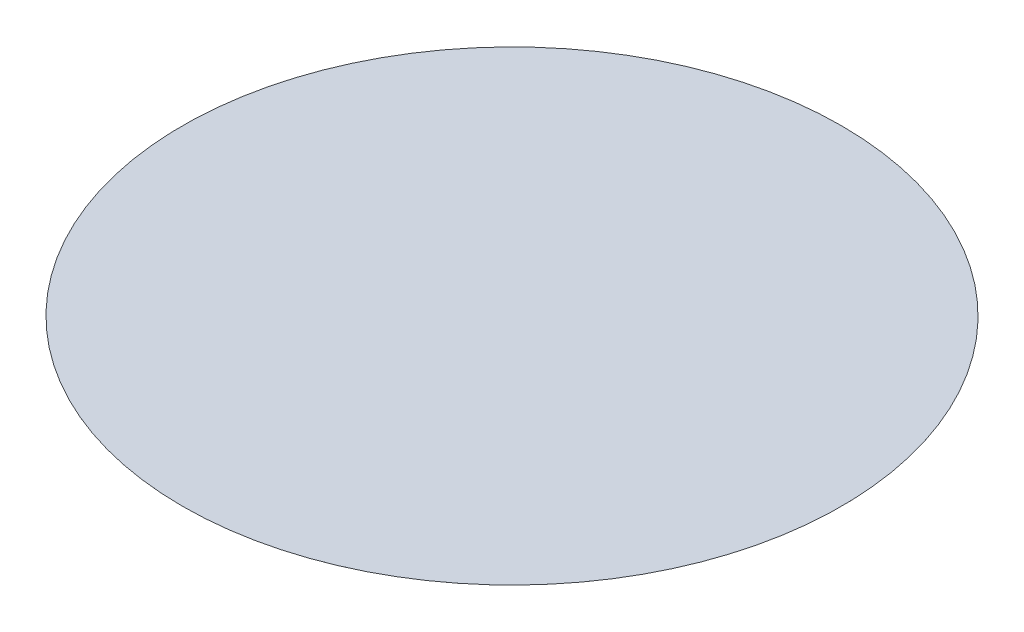
ISO-10303-21;
HEADER;
FILE_DESCRIPTION(('STEP AP214'),'2;1');
FILE_NAME('part.step','',(''),(''),'','','');
FILE_SCHEMA(('AUTOMOTIVE_DESIGN { 1 0 10303 214 1 1 1 1 }'));
ENDSEC;
DATA;
#1=APPLICATION_CONTEXT('core data for automotive mechanical design processes');
#2=APPLICATION_PROTOCOL_DEFINITION('international standard','automotive_design',2000,#1);
#3=PRODUCT_CONTEXT('',#1,'mechanical');
#4=PRODUCT('Part','Part','',(#3));
#5=PRODUCT_RELATED_PRODUCT_CATEGORY('part','',(#4));
#6=PRODUCT_DEFINITION_FORMATION('','',#4);
#7=PRODUCT_DEFINITION_CONTEXT('part definition',#1,'design');
#8=PRODUCT_DEFINITION('design','',#6,#7);
#9=PRODUCT_DEFINITION_SHAPE('','',#8);
#10=(LENGTH_UNIT() NAMED_UNIT(*) SI_UNIT(.MILLI.,.METRE.));
#11=(NAMED_UNIT(*) PLANE_ANGLE_UNIT() SI_UNIT($,.RADIAN.));
#12=(NAMED_UNIT(*) SI_UNIT($,.STERADIAN.) SOLID_ANGLE_UNIT());
#13=UNCERTAINTY_MEASURE_WITH_UNIT(LENGTH_MEASURE(1.E-05),#10,'distance_accuracy_value','');
#14=(GEOMETRIC_REPRESENTATION_CONTEXT(3) GLOBAL_UNCERTAINTY_ASSIGNED_CONTEXT((#13)) GLOBAL_UNIT_ASSIGNED_CONTEXT((#10,
#11,#12)) REPRESENTATION_CONTEXT('',''));
#15=CARTESIAN_POINT('',(0.,0.,0.));
#16=DIRECTION('',(0.,0.,1.));
#17=DIRECTION('',(1.,0.,0.));
#18=AXIS2_PLACEMENT_3D('',#15,#16,#17);
#19=CARTESIAN_POINT('',(0.,0.0001,0.));
#20=DIRECTION('',(0.,-1.,0.));
#21=DIRECTION('',(0.,0.,-1.));
#22=AXIS2_PLACEMENT_3D('',#19,#20,#21);
#23=CYLINDRICAL_SURFACE('',#22,10.);
#24=CARTESIAN_POINT('',(0.,0.0001,0.));
#25=DIRECTION('',(0.,1.,0.));
#26=DIRECTION('',(0.,0.,1.));
#27=AXIS2_PLACEMENT_3D('',#24,#25,#26);
#28=CIRCLE('',#27,10.);
#29=CARTESIAN_POINT('',(0.,0.0001,10.));
#30=VERTEX_POINT('',#29);
#31=EDGE_CURVE('E10',#30,#30,#28,.T.);
#32=ORIENTED_EDGE('',*,*,#31,.F.);
#33=EDGE_LOOP('',(#32));
#34=FACE_BOUND('',#33,.T.);
#35=CARTESIAN_POINT('',(0.,0.,0.));
#36=DIRECTION('',(0.,1.,0.));
#37=DIRECTION('',(0.,0.,1.));
#38=AXIS2_PLACEMENT_3D('',#35,#36,#37);
#39=CIRCLE('',#38,10.);
#40=CARTESIAN_POINT('',(0.,0.,10.));
#41=VERTEX_POINT('',#40);
#42=EDGE_CURVE('E35',#41,#41,#39,.T.);
#43=ORIENTED_EDGE('',*,*,#42,.T.);
#44=EDGE_LOOP('',(#43));
#45=FACE_BOUND('',#44,.T.);
#46=ADVANCED_FACE('F32',(#34,#45),#23,.T.);
#47=CARTESIAN_POINT('',(0.,0.0001,0.));
#48=DIRECTION('',(0.,1.,0.));
#49=DIRECTION('',(0.,0.,1.));
#50=AXIS2_PLACEMENT_3D('',#47,#48,#49);
#51=PLANE('',#50);
#52=ORIENTED_EDGE('',*,*,#31,.T.);
#53=EDGE_LOOP('',(#52));
#54=FACE_BOUND('',#53,.T.);
#55=ADVANCED_FACE('F47',(#54),#51,.T.);
#56=CARTESIAN_POINT('',(0.,0.,0.));
#57=DIRECTION('',(0.,1.,0.));
#58=DIRECTION('',(0.,0.,1.));
#59=AXIS2_PLACEMENT_3D('',#56,#57,#58);
#60=PLANE('',#59);
#61=ORIENTED_EDGE('',*,*,#42,.F.);
#62=EDGE_LOOP('',(#61));
#63=FACE_BOUND('',#62,.T.);
#64=ADVANCED_FACE('F45',(#63),#60,.F.);
#65=CLOSED_SHELL('',(#46,#55,#64));
#66=MANIFOLD_SOLID_BREP('B2',#65);
#67=ADVANCED_BREP_SHAPE_REPRESENTATION('',(#18,#66),#14);
#68=SHAPE_DEFINITION_REPRESENTATION(#9,#67);
ENDSEC;
END-ISO-10303-21;
